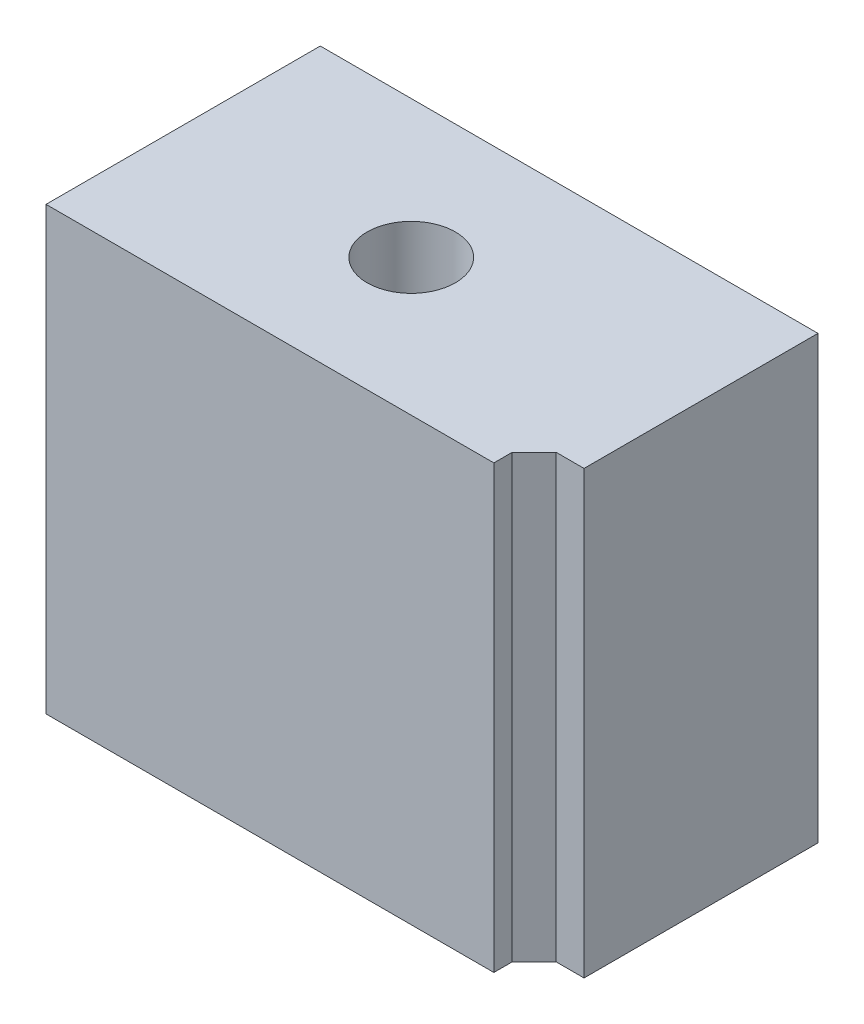
ISO-10303-21;
HEADER;
FILE_DESCRIPTION(('STEP AP214'),'2;1');
FILE_NAME('part.step','',(''),(''),'','','');
FILE_SCHEMA(('AUTOMOTIVE_DESIGN { 1 0 10303 214 1 1 1 1 }'));
ENDSEC;
DATA;
#1=APPLICATION_CONTEXT('core data for automotive mechanical design processes');
#2=APPLICATION_PROTOCOL_DEFINITION('international standard','automotive_design',2000,#1);
#3=PRODUCT_CONTEXT('',#1,'mechanical');
#4=PRODUCT('Part','Part','',(#3));
#5=PRODUCT_RELATED_PRODUCT_CATEGORY('part','',(#4));
#6=PRODUCT_DEFINITION_FORMATION('','',#4);
#7=PRODUCT_DEFINITION_CONTEXT('part definition',#1,'design');
#8=PRODUCT_DEFINITION('design','',#6,#7);
#9=PRODUCT_DEFINITION_SHAPE('','',#8);
#10=(LENGTH_UNIT() NAMED_UNIT(*) SI_UNIT(.MILLI.,.METRE.));
#11=(NAMED_UNIT(*) PLANE_ANGLE_UNIT() SI_UNIT($,.RADIAN.));
#12=(NAMED_UNIT(*) SI_UNIT($,.STERADIAN.) SOLID_ANGLE_UNIT());
#13=UNCERTAINTY_MEASURE_WITH_UNIT(LENGTH_MEASURE(1.E-05),#10,'distance_accuracy_value','');
#14=(GEOMETRIC_REPRESENTATION_CONTEXT(3) GLOBAL_UNCERTAINTY_ASSIGNED_CONTEXT((#13)) GLOBAL_UNIT_ASSIGNED_CONTEXT((#10,
#11,#12)) REPRESENTATION_CONTEXT('',''));
#15=CARTESIAN_POINT('',(0.,0.,0.));
#16=DIRECTION('',(0.,0.,1.));
#17=DIRECTION('',(1.,0.,0.));
#18=AXIS2_PLACEMENT_3D('',#15,#16,#17);
#19=CARTESIAN_POINT('',(54.690382874684,0.,21.8401092131986));
#20=DIRECTION('',(0.707106781186547,0.,0.707106781186548));
#21=DIRECTION('',(0.,1.,0.));
#22=AXIS2_PLACEMENT_3D('',#19,#20,#21);
#23=PLANE('',#22);
#24=DIRECTION('',(0.,-1.,0.));
#25=VECTOR('',#24,1.);
#26=CARTESIAN_POINT('',(54.690382874684,100.,21.8401092131986));
#27=LINE('',#26,#25);
#28=CARTESIAN_POINT('',(54.690382874684,100.,21.8401092131986));
#29=VERTEX_POINT('',#28);
#30=CARTESIAN_POINT('',(54.690382874684,0.,21.8401092131986));
#31=VERTEX_POINT('',#30);
#32=EDGE_CURVE('E106',#29,#31,#27,.T.);
#33=ORIENTED_EDGE('',*,*,#32,.F.);
#34=DIRECTION('',(-0.707106781186548,0.,0.707106781186547));
#35=VECTOR('',#34,1.);
#36=CARTESIAN_POINT('',(54.690382874684,100.,21.8401092131986));
#37=LINE('',#36,#35);
#38=CARTESIAN_POINT('',(49.690382874684,100.,26.8401092131986));
#39=VERTEX_POINT('',#38);
#40=EDGE_CURVE('E53',#29,#39,#37,.T.);
#41=ORIENTED_EDGE('',*,*,#40,.T.);
#42=DIRECTION('',(0.,1.,0.));
#43=VECTOR('',#42,1.);
#44=CARTESIAN_POINT('',(49.690382874684,100.,26.8401092131986));
#45=LINE('',#44,#43);
#46=CARTESIAN_POINT('',(49.690382874684,0.,26.8401092131986));
#47=VERTEX_POINT('',#46);
#48=EDGE_CURVE('E144',#47,#39,#45,.T.);
#49=ORIENTED_EDGE('',*,*,#48,.F.);
#50=DIRECTION('',(0.707106781186548,0.,-0.707106781186547));
#51=VECTOR('',#50,1.);
#52=CARTESIAN_POINT('',(38.2652460439413,0.,38.2652460439413));
#53=LINE('',#52,#51);
#54=EDGE_CURVE('E13',#47,#31,#53,.T.);
#55=ORIENTED_EDGE('',*,*,#54,.T.);
#56=EDGE_LOOP('',(#33,#41,#49,#55));
#57=FACE_BOUND('',#56,.T.);
#58=ADVANCED_FACE('F45',(#57),#23,.T.);
#59=CARTESIAN_POINT('',(60.9907873534478,100.,-31.1666759274694));
#60=DIRECTION('',(0.,0.,1.));
#61=DIRECTION('',(1.,0.,0.));
#62=AXIS2_PLACEMENT_3D('',#59,#60,#61);
#63=PLANE('',#62);
#64=DIRECTION('',(-1.,0.,0.));
#65=VECTOR('',#64,1.);
#66=CARTESIAN_POINT('',(60.9907873534478,0.,-31.1666759274694));
#67=LINE('',#66,#65);
#68=CARTESIAN_POINT('',(60.9907873534478,0.,-31.1666759274694));
#69=VERTEX_POINT('',#68);
#70=CARTESIAN_POINT('',(-51.7846307717953,0.,-31.1666759274694));
#71=VERTEX_POINT('',#70);
#72=EDGE_CURVE('E123',#69,#71,#67,.T.);
#73=ORIENTED_EDGE('',*,*,#72,.T.);
#74=DIRECTION('',(0.,-1.,0.));
#75=VECTOR('',#74,1.);
#76=CARTESIAN_POINT('',(-51.7846307717953,100.,-31.1666759274694));
#77=LINE('',#76,#75);
#78=CARTESIAN_POINT('',(-51.7846307717953,100.,-31.1666759274694));
#79=VERTEX_POINT('',#78);
#80=EDGE_CURVE('E140',#79,#71,#77,.T.);
#81=ORIENTED_EDGE('',*,*,#80,.F.);
#82=DIRECTION('',(-1.,0.,0.));
#83=VECTOR('',#82,1.);
#84=CARTESIAN_POINT('',(60.9907873534478,100.,-31.1666759274694));
#85=LINE('',#84,#83);
#86=CARTESIAN_POINT('',(60.9907873534478,100.,-31.1666759274694));
#87=VERTEX_POINT('',#86);
#88=EDGE_CURVE('E124',#87,#79,#85,.T.);
#89=ORIENTED_EDGE('',*,*,#88,.F.);
#90=DIRECTION('',(0.,-1.,0.));
#91=VECTOR('',#90,1.);
#92=CARTESIAN_POINT('',(60.9907873534478,100.,-31.1666759274694));
#93=LINE('',#92,#91);
#94=EDGE_CURVE('E135',#87,#69,#93,.T.);
#95=ORIENTED_EDGE('',*,*,#94,.T.);
#96=EDGE_LOOP('',(#73,#81,#89,#95));
#97=FACE_BOUND('',#96,.T.);
#98=ADVANCED_FACE('F198',(#97),#63,.F.);
#99=CARTESIAN_POINT('',(-51.7846307717953,100.,-31.1666759274694));
#100=DIRECTION('',(1.,0.,0.));
#101=DIRECTION('',(0.,0.,-1.));
#102=AXIS2_PLACEMENT_3D('',#99,#100,#101);
#103=PLANE('',#102);
#104=DIRECTION('',(0.,0.,1.));
#105=VECTOR('',#104,1.);
#106=CARTESIAN_POINT('',(-51.7846307717953,0.,-31.1666759274694));
#107=LINE('',#106,#105);
#108=CARTESIAN_POINT('',(-51.7846307717953,0.,30.974880998685));
#109=VERTEX_POINT('',#108);
#110=EDGE_CURVE('E131',#71,#109,#107,.T.);
#111=ORIENTED_EDGE('',*,*,#110,.T.);
#112=DIRECTION('',(0.,-1.,0.));
#113=VECTOR('',#112,1.);
#114=CARTESIAN_POINT('',(-51.7846307717953,100.,30.974880998685));
#115=LINE('',#114,#113);
#116=CARTESIAN_POINT('',(-51.7846307717953,100.,30.974880998685));
#117=VERTEX_POINT('',#116);
#118=EDGE_CURVE('E137',#117,#109,#115,.T.);
#119=ORIENTED_EDGE('',*,*,#118,.F.);
#120=DIRECTION('',(0.,0.,1.));
#121=VECTOR('',#120,1.);
#122=CARTESIAN_POINT('',(-51.7846307717953,100.,-31.1666759274694));
#123=LINE('',#122,#121);
#124=EDGE_CURVE('E128',#79,#117,#123,.T.);
#125=ORIENTED_EDGE('',*,*,#124,.F.);
#126=ORIENTED_EDGE('',*,*,#80,.T.);
#127=EDGE_LOOP('',(#111,#119,#125,#126));
#128=FACE_BOUND('',#127,.T.);
#129=ADVANCED_FACE('F168',(#128),#103,.F.);
#130=CARTESIAN_POINT('',(-51.7846307717953,100.,30.974880998685));
#131=DIRECTION('',(0.,0.,-1.));
#132=DIRECTION('',(-1.,0.,0.));
#133=AXIS2_PLACEMENT_3D('',#130,#131,#132);
#134=PLANE('',#133);
#135=DIRECTION('',(1.,0.,0.));
#136=VECTOR('',#135,1.);
#137=CARTESIAN_POINT('',(-51.7846307717953,0.,30.974880998685));
#138=LINE('',#137,#136);
#139=CARTESIAN_POINT('',(49.690382874684,0.,30.974880998685));
#140=VERTEX_POINT('',#139);
#141=EDGE_CURVE('E125',#109,#140,#138,.T.);
#142=ORIENTED_EDGE('',*,*,#141,.T.);
#143=DIRECTION('',(0.,1.,0.));
#144=VECTOR('',#143,1.);
#145=CARTESIAN_POINT('',(49.690382874684,0.,30.974880998685));
#146=LINE('',#145,#144);
#147=CARTESIAN_POINT('',(49.690382874684,100.,30.974880998685));
#148=VERTEX_POINT('',#147);
#149=EDGE_CURVE('E118',#140,#148,#146,.T.);
#150=ORIENTED_EDGE('',*,*,#149,.T.);
#151=DIRECTION('',(1.,0.,0.));
#152=VECTOR('',#151,1.);
#153=CARTESIAN_POINT('',(-51.7846307717953,100.,30.974880998685));
#154=LINE('',#153,#152);
#155=EDGE_CURVE('E155',#117,#148,#154,.T.);
#156=ORIENTED_EDGE('',*,*,#155,.F.);
#157=ORIENTED_EDGE('',*,*,#118,.T.);
#158=EDGE_LOOP('',(#142,#150,#156,#157));
#159=FACE_BOUND('',#158,.T.);
#160=ADVANCED_FACE('F172',(#159),#134,.F.);
#161=CARTESIAN_POINT('',(60.9907873534478,100.,30.974880998685));
#162=DIRECTION('',(-1.,0.,0.));
#163=DIRECTION('',(0.,0.,1.));
#164=AXIS2_PLACEMENT_3D('',#161,#162,#163);
#165=PLANE('',#164);
#166=DIRECTION('',(0.,0.,-1.));
#167=VECTOR('',#166,1.);
#168=CARTESIAN_POINT('',(60.9907873534478,100.,30.974880998685));
#169=LINE('',#168,#167);
#170=CARTESIAN_POINT('',(60.9907873534478,100.,21.8401092131986));
#171=VERTEX_POINT('',#170);
#172=EDGE_CURVE('E117',#171,#87,#169,.T.);
#173=ORIENTED_EDGE('',*,*,#172,.F.);
#174=DIRECTION('',(0.,1.,0.));
#175=VECTOR('',#174,1.);
#176=CARTESIAN_POINT('',(60.9907873534478,0.,21.8401092131986));
#177=LINE('',#176,#175);
#178=CARTESIAN_POINT('',(60.9907873534478,0.,21.8401092131986));
#179=VERTEX_POINT('',#178);
#180=EDGE_CURVE('E104',#179,#171,#177,.T.);
#181=ORIENTED_EDGE('',*,*,#180,.F.);
#182=DIRECTION('',(0.,0.,-1.));
#183=VECTOR('',#182,1.);
#184=CARTESIAN_POINT('',(60.9907873534478,0.,30.974880998685));
#185=LINE('',#184,#183);
#186=EDGE_CURVE('E115',#179,#69,#185,.T.);
#187=ORIENTED_EDGE('',*,*,#186,.T.);
#188=ORIENTED_EDGE('',*,*,#94,.F.);
#189=EDGE_LOOP('',(#173,#181,#187,#188));
#190=FACE_BOUND('',#189,.T.);
#191=ADVANCED_FACE('F113',(#190),#165,.F.);
#192=CARTESIAN_POINT('',(0.,100.,0.));
#193=DIRECTION('',(0.,1.,0.));
#194=DIRECTION('',(0.,0.,1.));
#195=AXIS2_PLACEMENT_3D('',#192,#193,#194);
#196=PLANE('',#195);
#197=CARTESIAN_POINT('',(0.,100.,0.));
#198=DIRECTION('',(0.,1.,0.));
#199=DIRECTION('',(0.,0.,1.));
#200=AXIS2_PLACEMENT_3D('',#197,#198,#199);
#201=CIRCLE('',#200,10.);
#202=CARTESIAN_POINT('',(0.,100.,10.));
#203=VERTEX_POINT('',#202);
#204=EDGE_CURVE('E174',#203,#203,#201,.T.);
#205=ORIENTED_EDGE('',*,*,#204,.F.);
#206=EDGE_LOOP('',(#205));
#207=FACE_BOUND('',#206,.T.);
#208=DIRECTION('',(0.,0.,1.));
#209=VECTOR('',#208,1.);
#210=CARTESIAN_POINT('',(49.690382874684,100.,21.8401092131986));
#211=LINE('',#210,#209);
#212=EDGE_CURVE('E109',#39,#148,#211,.T.);
#213=ORIENTED_EDGE('',*,*,#212,.F.);
#214=ORIENTED_EDGE('',*,*,#40,.F.);
#215=DIRECTION('',(-1.,0.,0.));
#216=VECTOR('',#215,1.);
#217=CARTESIAN_POINT('',(60.9907873534478,100.,21.8401092131986));
#218=LINE('',#217,#216);
#219=EDGE_CURVE('E156',#171,#29,#218,.T.);
#220=ORIENTED_EDGE('',*,*,#219,.F.);
#221=ORIENTED_EDGE('',*,*,#172,.T.);
#222=ORIENTED_EDGE('',*,*,#88,.T.);
#223=ORIENTED_EDGE('',*,*,#124,.T.);
#224=ORIENTED_EDGE('',*,*,#155,.T.);
#225=EDGE_LOOP('',(#213,#214,#220,#221,#222,#223,#224));
#226=FACE_BOUND('',#225,.T.);
#227=ADVANCED_FACE('F153',(#207,#226),#196,.T.);
#228=CARTESIAN_POINT('',(0.,0.,0.));
#229=DIRECTION('',(0.,1.,0.));
#230=DIRECTION('',(0.,0.,1.));
#231=AXIS2_PLACEMENT_3D('',#228,#229,#230);
#232=PLANE('',#231);
#233=CARTESIAN_POINT('',(0.,0.,0.));
#234=DIRECTION('',(0.,1.,0.));
#235=DIRECTION('',(0.,0.,1.));
#236=AXIS2_PLACEMENT_3D('',#233,#234,#235);
#237=CIRCLE('',#236,10.);
#238=CARTESIAN_POINT('',(0.,0.,10.));
#239=VERTEX_POINT('',#238);
#240=EDGE_CURVE('E158',#239,#239,#237,.T.);
#241=ORIENTED_EDGE('',*,*,#240,.T.);
#242=EDGE_LOOP('',(#241));
#243=FACE_BOUND('',#242,.T.);
#244=ORIENTED_EDGE('',*,*,#54,.F.);
#245=DIRECTION('',(0.,0.,1.));
#246=VECTOR('',#245,1.);
#247=CARTESIAN_POINT('',(49.690382874684,0.,21.8401092131986));
#248=LINE('',#247,#246);
#249=EDGE_CURVE('E108',#47,#140,#248,.T.);
#250=ORIENTED_EDGE('',*,*,#249,.T.);
#251=ORIENTED_EDGE('',*,*,#141,.F.);
#252=ORIENTED_EDGE('',*,*,#110,.F.);
#253=ORIENTED_EDGE('',*,*,#72,.F.);
#254=ORIENTED_EDGE('',*,*,#186,.F.);
#255=DIRECTION('',(-1.,0.,0.));
#256=VECTOR('',#255,1.);
#257=CARTESIAN_POINT('',(60.9907873534478,0.,21.8401092131986));
#258=LINE('',#257,#256);
#259=EDGE_CURVE('E100',#179,#31,#258,.T.);
#260=ORIENTED_EDGE('',*,*,#259,.T.);
#261=EDGE_LOOP('',(#244,#250,#251,#252,#253,#254,#260));
#262=FACE_BOUND('',#261,.T.);
#263=ADVANCED_FACE('F121',(#243,#262),#232,.F.);
#264=CARTESIAN_POINT('',(49.690382874684,0.,21.8401092131986));
#265=DIRECTION('',(-1.,0.,0.));
#266=DIRECTION('',(0.,0.,1.));
#267=AXIS2_PLACEMENT_3D('',#264,#265,#266);
#268=PLANE('',#267);
#269=ORIENTED_EDGE('',*,*,#249,.F.);
#270=ORIENTED_EDGE('',*,*,#48,.T.);
#271=ORIENTED_EDGE('',*,*,#212,.T.);
#272=ORIENTED_EDGE('',*,*,#149,.F.);
#273=EDGE_LOOP('',(#269,#270,#271,#272));
#274=FACE_BOUND('',#273,.T.);
#275=ADVANCED_FACE('F148',(#274),#268,.F.);
#276=CARTESIAN_POINT('',(60.9907873534478,0.,21.8401092131986));
#277=DIRECTION('',(0.,0.,-1.));
#278=DIRECTION('',(-1.,0.,0.));
#279=AXIS2_PLACEMENT_3D('',#276,#277,#278);
#280=PLANE('',#279);
#281=ORIENTED_EDGE('',*,*,#219,.T.);
#282=ORIENTED_EDGE('',*,*,#32,.T.);
#283=ORIENTED_EDGE('',*,*,#259,.F.);
#284=ORIENTED_EDGE('',*,*,#180,.T.);
#285=EDGE_LOOP('',(#281,#282,#283,#284));
#286=FACE_BOUND('',#285,.T.);
#287=ADVANCED_FACE('F103',(#286),#280,.F.);
#288=CARTESIAN_POINT('',(0.,0.,0.));
#289=DIRECTION('',(0.,1.,0.));
#290=DIRECTION('',(0.,0.,1.));
#291=AXIS2_PLACEMENT_3D('',#288,#289,#290);
#292=CYLINDRICAL_SURFACE('',#291,10.);
#293=CARTESIAN_POINT('',(0.,0.,10.));
#294=CARTESIAN_POINT('',(0.,1.04166666666666,10.));
#295=CARTESIAN_POINT('',(0.,2.08333333333333,10.));
#296=CARTESIAN_POINT('',(0.,4.16666666666667,10.));
#297=CARTESIAN_POINT('',(0.,5.20833333333334,10.));
#298=CARTESIAN_POINT('',(0.,7.29166666666667,10.));
#299=CARTESIAN_POINT('',(0.,8.33333333333334,10.));
#300=CARTESIAN_POINT('',(0.,10.4166666666667,10.));
#301=CARTESIAN_POINT('',(0.,11.4583333333333,10.));
#302=CARTESIAN_POINT('',(0.,13.5416666666667,10.));
#303=CARTESIAN_POINT('',(0.,14.5833333333333,10.));
#304=CARTESIAN_POINT('',(0.,16.6666666666667,10.));
#305=CARTESIAN_POINT('',(0.,17.7083333333333,10.));
#306=CARTESIAN_POINT('',(0.,19.7916666666667,10.));
#307=CARTESIAN_POINT('',(0.,20.8333333333333,10.));
#308=CARTESIAN_POINT('',(0.,22.9166666666667,10.));
#309=CARTESIAN_POINT('',(0.,23.9583333333333,10.));
#310=CARTESIAN_POINT('',(0.,26.0416666666667,10.));
#311=CARTESIAN_POINT('',(0.,27.0833333333333,10.));
#312=CARTESIAN_POINT('',(0.,29.1666666666667,10.));
#313=CARTESIAN_POINT('',(0.,30.2083333333333,10.));
#314=CARTESIAN_POINT('',(0.,32.2916666666667,10.));
#315=CARTESIAN_POINT('',(0.,33.3333333333333,10.));
#316=CARTESIAN_POINT('',(0.,35.4166666666667,10.));
#317=CARTESIAN_POINT('',(0.,36.4583333333333,10.));
#318=CARTESIAN_POINT('',(0.,38.5416666666667,10.));
#319=CARTESIAN_POINT('',(0.,39.5833333333333,10.));
#320=CARTESIAN_POINT('',(0.,41.6666666666667,10.));
#321=CARTESIAN_POINT('',(0.,42.7083333333333,10.));
#322=CARTESIAN_POINT('',(0.,44.7916666666667,10.));
#323=CARTESIAN_POINT('',(0.,45.8333333333333,10.));
#324=CARTESIAN_POINT('',(0.,47.9166666666667,10.));
#325=CARTESIAN_POINT('',(0.,48.9583333333334,10.));
#326=CARTESIAN_POINT('',(0.,51.0416666666667,10.));
#327=CARTESIAN_POINT('',(0.,52.0833333333334,10.));
#328=CARTESIAN_POINT('',(0.,54.1666666666667,10.));
#329=CARTESIAN_POINT('',(0.,55.2083333333334,10.));
#330=CARTESIAN_POINT('',(0.,57.2916666666667,10.));
#331=CARTESIAN_POINT('',(0.,58.3333333333334,10.));
#332=CARTESIAN_POINT('',(0.,60.4166666666667,10.));
#333=CARTESIAN_POINT('',(0.,61.4583333333334,10.));
#334=CARTESIAN_POINT('',(0.,63.5416666666667,10.));
#335=CARTESIAN_POINT('',(0.,64.5833333333334,10.));
#336=CARTESIAN_POINT('',(0.,66.6666666666667,10.));
#337=CARTESIAN_POINT('',(0.,67.7083333333334,10.));
#338=CARTESIAN_POINT('',(0.,69.7916666666667,10.));
#339=CARTESIAN_POINT('',(0.,70.8333333333334,10.));
#340=CARTESIAN_POINT('',(0.,72.9166666666667,10.));
#341=CARTESIAN_POINT('',(0.,73.9583333333334,10.));
#342=CARTESIAN_POINT('',(0.,76.0416666666667,10.));
#343=CARTESIAN_POINT('',(0.,77.0833333333334,10.));
#344=CARTESIAN_POINT('',(0.,79.1666666666667,10.));
#345=CARTESIAN_POINT('',(0.,80.2083333333334,10.));
#346=CARTESIAN_POINT('',(0.,82.2916666666667,10.));
#347=CARTESIAN_POINT('',(0.,83.3333333333334,10.));
#348=CARTESIAN_POINT('',(0.,85.4166666666667,10.));
#349=CARTESIAN_POINT('',(0.,86.4583333333334,10.));
#350=CARTESIAN_POINT('',(0.,88.5416666666667,10.));
#351=CARTESIAN_POINT('',(0.,89.5833333333334,10.));
#352=CARTESIAN_POINT('',(0.,91.6666666666667,10.));
#353=CARTESIAN_POINT('',(0.,92.7083333333334,10.));
#354=CARTESIAN_POINT('',(0.,94.7916666666667,10.));
#355=CARTESIAN_POINT('',(0.,95.8333333333334,10.));
#356=CARTESIAN_POINT('',(0.,97.9166666666667,10.));
#357=CARTESIAN_POINT('',(0.,98.9583333333334,10.));
#358=CARTESIAN_POINT('',(0.,100.,10.));
#359=B_SPLINE_CURVE_WITH_KNOTS('',3,(#293,#294,#295,#296,#297,#298,#299,#300,#301,#302,#303,
#304,#305,#306,#307,#308,#309,#310,#311,#312,#313,#314,#315,#316,#317,#318,#319,#320,#321,#322,
#323,#324,#325,#326,#327,#328,#329,#330,#331,#332,#333,#334,#335,#336,#337,#338,#339,#340,#341,
#342,#343,#344,#345,#346,#347,#348,#349,#350,#351,#352,#353,#354,#355,#356,#357,#358),
.UNSPECIFIED.,.F.,.F.,(4,2,2,2,2,2,2,2,2,2,2,2,2,2,2,2,2,2,2,2,2,2,2,2,2,2,2,2,2,2,2,2,4),(0.,
3.125,6.25,9.375,12.5,15.625,18.75,21.875,25.,28.125,31.25,34.375,37.5,40.625,43.75,46.875,50.,
53.125,56.25,59.375,62.5,65.625,68.75,71.875,75.,78.125,81.25,84.375,87.5,90.625,93.75,96.875,
100.),.UNSPECIFIED.);
#360=EDGE_CURVE('BSEAM181',#239,#203,#359,.T.);
#361=ORIENTED_EDGE('',*,*,#240,.F.);
#362=ORIENTED_EDGE('',*,*,#204,.T.);
#363=ORIENTED_EDGE('',*,*,#360,.T.);
#364=ORIENTED_EDGE('',*,*,#360,.F.);
#365=EDGE_LOOP('',(#361,#363,#362,#364));
#366=FACE_BOUND('',#365,.T.);
#367=ADVANCED_FACE('F181',(#366),#292,.F.);
#368=CLOSED_SHELL('',(#58,#98,#129,#160,#191,#227,#263,#275,#287,#367));
#369=MANIFOLD_SOLID_BREP('B2',#368);
#370=ADVANCED_BREP_SHAPE_REPRESENTATION('',(#18,#369),#14);
#371=SHAPE_DEFINITION_REPRESENTATION(#9,#370);
ENDSEC;
END-ISO-10303-21;
